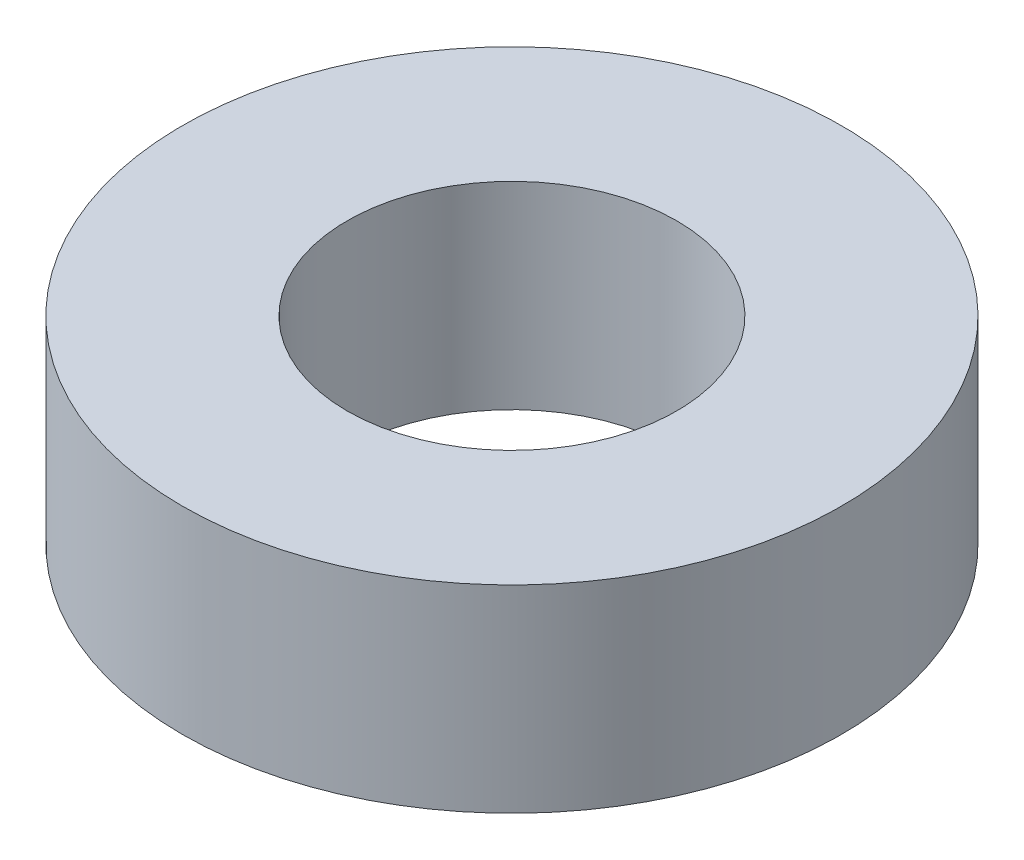
ISO-10303-21;
HEADER;
FILE_DESCRIPTION(('STEP AP214'),'2;1');
FILE_NAME('part.step','',(''),(''),'','','');
FILE_SCHEMA(('AUTOMOTIVE_DESIGN { 1 0 10303 214 1 1 1 1 }'));
ENDSEC;
DATA;
#1=APPLICATION_CONTEXT('core data for automotive mechanical design processes');
#2=APPLICATION_PROTOCOL_DEFINITION('international standard','automotive_design',2000,#1);
#3=PRODUCT_CONTEXT('',#1,'mechanical');
#4=PRODUCT('Part','Part','',(#3));
#5=PRODUCT_RELATED_PRODUCT_CATEGORY('part','',(#4));
#6=PRODUCT_DEFINITION_FORMATION('','',#4);
#7=PRODUCT_DEFINITION_CONTEXT('part definition',#1,'design');
#8=PRODUCT_DEFINITION('design','',#6,#7);
#9=PRODUCT_DEFINITION_SHAPE('','',#8);
#10=(LENGTH_UNIT() NAMED_UNIT(*) SI_UNIT(.MILLI.,.METRE.));
#11=(NAMED_UNIT(*) PLANE_ANGLE_UNIT() SI_UNIT($,.RADIAN.));
#12=(NAMED_UNIT(*) SI_UNIT($,.STERADIAN.) SOLID_ANGLE_UNIT());
#13=UNCERTAINTY_MEASURE_WITH_UNIT(LENGTH_MEASURE(1.E-05),#10,'distance_accuracy_value','');
#14=(GEOMETRIC_REPRESENTATION_CONTEXT(3) GLOBAL_UNCERTAINTY_ASSIGNED_CONTEXT((#13)) GLOBAL_UNIT_ASSIGNED_CONTEXT((#10,
#11,#12)) REPRESENTATION_CONTEXT('',''));
#15=CARTESIAN_POINT('',(0.,0.,0.));
#16=DIRECTION('',(0.,0.,1.));
#17=DIRECTION('',(1.,0.,0.));
#18=AXIS2_PLACEMENT_3D('',#15,#16,#17);
#19=CARTESIAN_POINT('',(0.,1.5,0.));
#20=DIRECTION('',(0.,1.,0.));
#21=DIRECTION('',(0.,0.,1.));
#22=AXIS2_PLACEMENT_3D('',#19,#20,#21);
#23=PLANE('',#22);
#24=CARTESIAN_POINT('',(0.,1.5,0.));
#25=DIRECTION('',(0.,1.,0.));
#26=DIRECTION('',(0.,0.,1.));
#27=AXIS2_PLACEMENT_3D('',#24,#25,#26);
#28=CIRCLE('',#27,5.);
#29=CARTESIAN_POINT('',(0.,1.5,5.));
#30=VERTEX_POINT('',#29);
#31=EDGE_CURVE('E10',#30,#30,#28,.T.);
#32=ORIENTED_EDGE('',*,*,#31,.T.);
#33=EDGE_LOOP('',(#32));
#34=FACE_BOUND('',#33,.T.);
#35=CARTESIAN_POINT('',(0.,1.5,0.));
#36=DIRECTION('',(0.,1.,0.));
#37=DIRECTION('',(0.,0.,1.));
#38=AXIS2_PLACEMENT_3D('',#35,#36,#37);
#39=CIRCLE('',#38,2.5);
#40=CARTESIAN_POINT('',(0.,1.5,2.5));
#41=VERTEX_POINT('',#40);
#42=EDGE_CURVE('E48',#41,#41,#39,.T.);
#43=ORIENTED_EDGE('',*,*,#42,.F.);
#44=EDGE_LOOP('',(#43));
#45=FACE_BOUND('',#44,.T.);
#46=ADVANCED_FACE('F40',(#34,#45),#23,.T.);
#47=CARTESIAN_POINT('',(0.,-1.5,0.));
#48=DIRECTION('',(0.,1.,0.));
#49=DIRECTION('',(0.,0.,1.));
#50=AXIS2_PLACEMENT_3D('',#47,#48,#49);
#51=PLANE('',#50);
#52=CARTESIAN_POINT('',(0.,-1.5,0.));
#53=DIRECTION('',(0.,1.,0.));
#54=DIRECTION('',(0.,0.,1.));
#55=AXIS2_PLACEMENT_3D('',#52,#53,#54);
#56=CIRCLE('',#55,5.);
#57=CARTESIAN_POINT('',(0.,-1.5,5.));
#58=VERTEX_POINT('',#57);
#59=EDGE_CURVE('E41',#58,#58,#56,.T.);
#60=ORIENTED_EDGE('',*,*,#59,.F.);
#61=EDGE_LOOP('',(#60));
#62=FACE_BOUND('',#61,.T.);
#63=CARTESIAN_POINT('',(0.,-1.5,0.));
#64=DIRECTION('',(0.,1.,0.));
#65=DIRECTION('',(0.,0.,1.));
#66=AXIS2_PLACEMENT_3D('',#63,#64,#65);
#67=CIRCLE('',#66,2.5);
#68=CARTESIAN_POINT('',(0.,-1.5,2.5));
#69=VERTEX_POINT('',#68);
#70=EDGE_CURVE('E49',#69,#69,#67,.T.);
#71=ORIENTED_EDGE('',*,*,#70,.T.);
#72=EDGE_LOOP('',(#71));
#73=FACE_BOUND('',#72,.T.);
#74=ADVANCED_FACE('F58',(#62,#73),#51,.F.);
#75=CARTESIAN_POINT('',(0.,1.5,0.));
#76=DIRECTION('',(0.,-1.,0.));
#77=DIRECTION('',(0.,0.,-1.));
#78=AXIS2_PLACEMENT_3D('',#75,#76,#77);
#79=CYLINDRICAL_SURFACE('',#78,5.);
#80=ORIENTED_EDGE('',*,*,#31,.F.);
#81=EDGE_LOOP('',(#80));
#82=FACE_BOUND('',#81,.T.);
#83=ORIENTED_EDGE('',*,*,#59,.T.);
#84=EDGE_LOOP('',(#83));
#85=FACE_BOUND('',#84,.T.);
#86=ADVANCED_FACE('F39',(#82,#85),#79,.T.);
#87=CARTESIAN_POINT('',(0.,1.5,0.));
#88=DIRECTION('',(0.,-1.,0.));
#89=DIRECTION('',(0.,0.,-1.));
#90=AXIS2_PLACEMENT_3D('',#87,#88,#89);
#91=CYLINDRICAL_SURFACE('',#90,2.5);
#92=ORIENTED_EDGE('',*,*,#42,.T.);
#93=EDGE_LOOP('',(#92));
#94=FACE_BOUND('',#93,.T.);
#95=ORIENTED_EDGE('',*,*,#70,.F.);
#96=EDGE_LOOP('',(#95));
#97=FACE_BOUND('',#96,.T.);
#98=ADVANCED_FACE('F57',(#94,#97),#91,.F.);
#99=CLOSED_SHELL('',(#46,#74,#86,#98));
#100=MANIFOLD_SOLID_BREP('B2',#99);
#101=ADVANCED_BREP_SHAPE_REPRESENTATION('',(#18,#100),#14);
#102=SHAPE_DEFINITION_REPRESENTATION(#9,#101);
ENDSEC;
END-ISO-10303-21;
